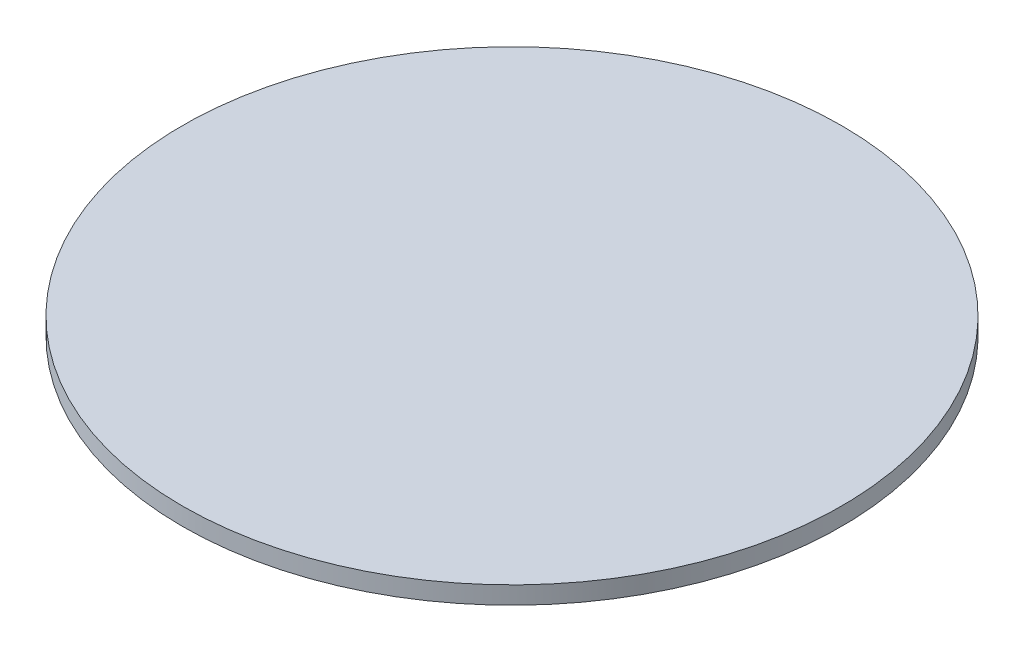
ISO-10303-21;
HEADER;
FILE_DESCRIPTION(('STEP AP214'),'2;1');
FILE_NAME('part.step','',(''),(''),'','','');
FILE_SCHEMA(('AUTOMOTIVE_DESIGN { 1 0 10303 214 1 1 1 1 }'));
ENDSEC;
DATA;
#1=APPLICATION_CONTEXT('core data for automotive mechanical design processes');
#2=APPLICATION_PROTOCOL_DEFINITION('international standard','automotive_design',2000,#1);
#3=PRODUCT_CONTEXT('',#1,'mechanical');
#4=PRODUCT('Part','Part','',(#3));
#5=PRODUCT_RELATED_PRODUCT_CATEGORY('part','',(#4));
#6=PRODUCT_DEFINITION_FORMATION('','',#4);
#7=PRODUCT_DEFINITION_CONTEXT('part definition',#1,'design');
#8=PRODUCT_DEFINITION('design','',#6,#7);
#9=PRODUCT_DEFINITION_SHAPE('','',#8);
#10=(LENGTH_UNIT() NAMED_UNIT(*) SI_UNIT(.MILLI.,.METRE.));
#11=(NAMED_UNIT(*) PLANE_ANGLE_UNIT() SI_UNIT($,.RADIAN.));
#12=(NAMED_UNIT(*) SI_UNIT($,.STERADIAN.) SOLID_ANGLE_UNIT());
#13=UNCERTAINTY_MEASURE_WITH_UNIT(LENGTH_MEASURE(1.E-05),#10,'distance_accuracy_value','');
#14=(GEOMETRIC_REPRESENTATION_CONTEXT(3) GLOBAL_UNCERTAINTY_ASSIGNED_CONTEXT((#13)) GLOBAL_UNIT_ASSIGNED_CONTEXT((#10,
#11,#12)) REPRESENTATION_CONTEXT('',''));
#15=CARTESIAN_POINT('',(0.,0.,0.));
#16=DIRECTION('',(0.,0.,1.));
#17=DIRECTION('',(1.,0.,0.));
#18=AXIS2_PLACEMENT_3D('',#15,#16,#17);
#19=CARTESIAN_POINT('',(0.,1.23,0.));
#20=DIRECTION('',(0.,-1.,0.));
#21=DIRECTION('',(0.,0.,-1.));
#22=AXIS2_PLACEMENT_3D('',#19,#20,#21);
#23=CYLINDRICAL_SURFACE('',#22,17.92);
#24=CARTESIAN_POINT('',(0.,1.23,0.));
#25=DIRECTION('',(0.,1.,0.));
#26=DIRECTION('',(0.,0.,1.));
#27=AXIS2_PLACEMENT_3D('',#24,#25,#26);
#28=CIRCLE('',#27,17.92);
#29=CARTESIAN_POINT('',(0.,1.23,17.92));
#30=VERTEX_POINT('',#29);
#31=EDGE_CURVE('E10',#30,#30,#28,.T.);
#32=ORIENTED_EDGE('',*,*,#31,.F.);
#33=EDGE_LOOP('',(#32));
#34=FACE_BOUND('',#33,.T.);
#35=CARTESIAN_POINT('',(0.,0.27,0.));
#36=DIRECTION('',(0.,1.,0.));
#37=DIRECTION('',(0.,0.,1.));
#38=AXIS2_PLACEMENT_3D('',#35,#36,#37);
#39=CIRCLE('',#38,17.92);
#40=CARTESIAN_POINT('',(0.,0.27,17.92));
#41=VERTEX_POINT('',#40);
#42=EDGE_CURVE('E44',#41,#41,#39,.T.);
#43=ORIENTED_EDGE('',*,*,#42,.T.);
#44=EDGE_LOOP('',(#43));
#45=FACE_BOUND('',#44,.T.);
#46=ADVANCED_FACE('F41',(#34,#45),#23,.T.);
#47=CARTESIAN_POINT('',(0.,1.23,0.));
#48=DIRECTION('',(0.,1.,0.));
#49=DIRECTION('',(0.,0.,1.));
#50=AXIS2_PLACEMENT_3D('',#47,#48,#49);
#51=PLANE('',#50);
#52=ORIENTED_EDGE('',*,*,#31,.T.);
#53=EDGE_LOOP('',(#52));
#54=FACE_BOUND('',#53,.T.);
#55=ADVANCED_FACE('F56',(#54),#51,.T.);
#56=CARTESIAN_POINT('',(0.,0.27,0.));
#57=DIRECTION('',(0.,1.,0.));
#58=DIRECTION('',(0.,0.,1.));
#59=AXIS2_PLACEMENT_3D('',#56,#57,#58);
#60=PLANE('',#59);
#61=ORIENTED_EDGE('',*,*,#42,.F.);
#62=EDGE_LOOP('',(#61));
#63=FACE_BOUND('',#62,.T.);
#64=ADVANCED_FACE('F54',(#63),#60,.F.);
#65=CLOSED_SHELL('',(#46,#55,#64));
#66=MANIFOLD_SOLID_BREP('B2',#65);
#67=ADVANCED_BREP_SHAPE_REPRESENTATION('',(#18,#66),#14);
#68=SHAPE_DEFINITION_REPRESENTATION(#9,#67);
ENDSEC;
END-ISO-10303-21;
